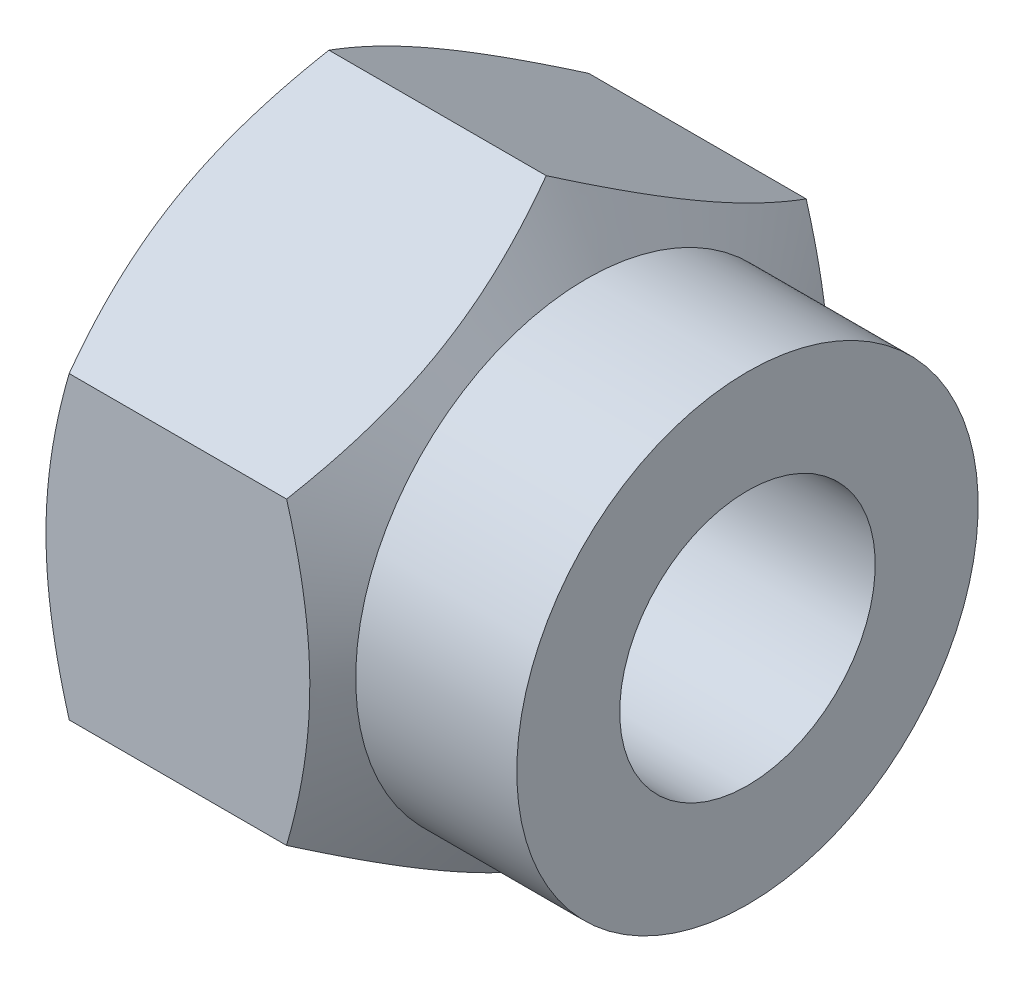
ISO-10303-21;
HEADER;
FILE_DESCRIPTION(('STEP AP214'),'2;1');
FILE_NAME('part.step','',(''),(''),'','','');
FILE_SCHEMA(('AUTOMOTIVE_DESIGN { 1 0 10303 214 1 1 1 1 }'));
ENDSEC;
DATA;
#1=APPLICATION_CONTEXT('core data for automotive mechanical design processes');
#2=APPLICATION_PROTOCOL_DEFINITION('international standard','automotive_design',2000,#1);
#3=PRODUCT_CONTEXT('',#1,'mechanical');
#4=PRODUCT('Part','Part','',(#3));
#5=PRODUCT_RELATED_PRODUCT_CATEGORY('part','',(#4));
#6=PRODUCT_DEFINITION_FORMATION('','',#4);
#7=PRODUCT_DEFINITION_CONTEXT('part definition',#1,'design');
#8=PRODUCT_DEFINITION('design','',#6,#7);
#9=PRODUCT_DEFINITION_SHAPE('','',#8);
#10=(LENGTH_UNIT() NAMED_UNIT(*) SI_UNIT(.MILLI.,.METRE.));
#11=(NAMED_UNIT(*) PLANE_ANGLE_UNIT() SI_UNIT($,.RADIAN.));
#12=(NAMED_UNIT(*) SI_UNIT($,.STERADIAN.) SOLID_ANGLE_UNIT());
#13=UNCERTAINTY_MEASURE_WITH_UNIT(LENGTH_MEASURE(1.E-05),#10,'distance_accuracy_value','');
#14=(GEOMETRIC_REPRESENTATION_CONTEXT(3) GLOBAL_UNCERTAINTY_ASSIGNED_CONTEXT((#13)) GLOBAL_UNIT_ASSIGNED_CONTEXT((#10,
#11,#12)) REPRESENTATION_CONTEXT('',''));
#15=CARTESIAN_POINT('',(0.,0.,0.));
#16=DIRECTION('',(0.,0.,1.));
#17=DIRECTION('',(1.,0.,0.));
#18=AXIS2_PLACEMENT_3D('',#15,#16,#17);
#19=CARTESIAN_POINT('',(-7.86770648630863E-13,5.77499999999995,0.00259341371129267));
#20=DIRECTION('',(0.,0.86602540378445,-0.49999999999998));
#21=DIRECTION('',(0.,0.49999999999998,0.86602540378445));
#22=AXIS2_PLACEMENT_3D('',#19,#20,#21);
#23=PLANE('',#22);
#24=CARTESIAN_POINT('',(0.447446866115409,5.77499964515535,0.0025932774604168));
#25=CARTESIAN_POINT('',(0.379476109185398,5.65739164957564,-0.201110057525818));
#26=CARTESIAN_POINT('',(0.317198562123472,5.53884079225652,-0.406446289102597));
#27=CARTESIAN_POINT('',(0.207368111212527,5.3006927162739,-0.818930943554232));
#28=CARTESIAN_POINT('',(0.159742291939182,5.18110382804692,-1.02606493849483));
#29=CARTESIAN_POINT('',(0.101263150025257,5.00058980202028,-1.33872439110243));
#30=CARTESIAN_POINT('',(0.0839229114067567,4.94018996501232,-1.44333998048222));
#31=CARTESIAN_POINT('',(0.0539060309740201,4.81910059056732,-1.65307293142466));
#32=CARTESIAN_POINT('',(0.0412292656630741,4.75841106084494,-1.75819027962519));
#33=CARTESIAN_POINT('',(0.0207624921934346,4.6365174825838,-1.9693161496736));
#34=CARTESIAN_POINT('',(0.0129973722235834,4.57531238126786,-2.07532649498965));
#35=CARTESIAN_POINT('',(0.00260535476316538,4.45278152955334,-2.28755615596286));
#36=CARTESIAN_POINT('',(-2.05208356367485E-05,4.39145575758665,-2.39377550897709));
#37=CARTESIAN_POINT('',(3.47900495748323E-11,4.33012701892297,-2.49999999999767));
#38=B_SPLINE_CURVE_WITH_KNOTS('',3,(#24,#25,#26,#27,#28,#29,#30,#31,#32,#33,#34,#35,#36,#37),
.UNSPECIFIED.,.F.,.F.,(4,2,2,2,2,2,4),(0.,0.734818386072243,1.4659184211973,1.83194961192585,
2.19797110882767,2.56583274978381,2.93376752923617),.UNSPECIFIED.);
#39=CARTESIAN_POINT('',(0.447446590098363,5.77499964519972,0.00259380752496701));
#40=VERTEX_POINT('',#39);
#41=CARTESIAN_POINT('',(1.73953868917269E-11,4.33012701889626,-2.49999999998368));
#42=VERTEX_POINT('',#41);
#43=EDGE_CURVE('E246',#40,#42,#38,.T.);
#44=ORIENTED_EDGE('',*,*,#43,.F.);
#45=DIRECTION('',(1.,0.,0.));
#46=VECTOR('',#45,1.);
#47=CARTESIAN_POINT('',(-6.96531721189331E-13,5.77499941722784,0.00259442101177652));
#48=LINE('',#47,#46);
#49=CARTESIAN_POINT('',(4.6292372928015,5.77499958682207,0.00259412787428472));
#50=VERTEX_POINT('',#49);
#51=EDGE_CURVE('E242',#50,#40,#48,.F.);
#52=ORIENTED_EDGE('',*,*,#51,.F.);
#53=CARTESIAN_POINT('',(4.6301018522595,2.88675132928964,-5.0000000288525));
#54=CARTESIAN_POINT('',(4.70335874674609,3.01361369098422,-4.7802679728293));
#55=CARTESIAN_POINT('',(4.76998840582848,3.14156112063708,-4.55865652397268));
#56=CARTESIAN_POINT('',(4.88628900768838,3.39967140626251,-4.11159639531331));
#57=CARTESIAN_POINT('',(4.93591880534108,3.52983884787868,-3.88613977294282));
#58=CARTESIAN_POINT('',(5.01315816267062,3.78857939051774,-3.43798800711402));
#59=CARTESIAN_POINT('',(5.0412824191911,3.91711219165528,-3.21536266510464));
#60=CARTESIAN_POINT('',(5.06649871854697,4.11036331352771,-2.88064190340188));
#61=CARTESIAN_POINT('',(5.07207720160437,4.1748243958838,-2.76899203365024));
#62=CARTESIAN_POINT('',(5.07748272794144,4.30380607226849,-2.54558921690654));
#63=CARTESIAN_POINT('',(5.07730994797589,4.36832666440722,-2.43383627318783));
#64=CARTESIAN_POINT('',(5.06891609463271,4.54520691168325,-2.12747069805039));
#65=CARTESIAN_POINT('',(5.0548130086538,4.65750778538959,-1.93295987905661));
#66=CARTESIAN_POINT('',(5.01009329399109,4.8813629396889,-1.54523137827403));
#67=CARTESIAN_POINT('',(4.97946133486853,4.992916429688,-1.35201506583395));
#68=CARTESIAN_POINT('',(4.90289228624982,5.21722256114044,-0.96350544970908));
#69=CARTESIAN_POINT('',(4.85663039669875,5.32994681266453,-0.768261318824162));
#70=CARTESIAN_POINT('',(4.7516401624323,5.55371179734529,-0.380688996402192));
#71=CARTESIAN_POINT('',(4.69293654542829,5.66475540850885,-0.188355820010982));
#72=CARTESIAN_POINT('',(4.62923713650707,5.77499985796322,0.00259316769646688));
#73=B_SPLINE_CURVE_WITH_KNOTS('',3,(#53,#54,#55,#56,#57,#58,#59,#60,#61,#62,#63,#64,#65,#66,#67,
#68,#69,#70,#71,#72),.UNSPECIFIED.,.F.,.F.,(4,2,2,2,2,2,2,2,2,4),(0.,0.792543058340322,
1.58699099131343,2.3617723864132,2.7487889916648,3.13579370266388,3.81021941586707,
4.4852717331079,5.17531615714681,5.86400177975548),.UNSPECIFIED.);
#74=CARTESIAN_POINT('',(4.63010185706844,2.88675133761898,-5.00000001442568));
#75=VERTEX_POINT('',#74);
#76=EDGE_CURVE('E79',#75,#50,#73,.T.);
#77=ORIENTED_EDGE('',*,*,#76,.F.);
#78=DIRECTION('',(-1.,0.,0.));
#79=VECTOR('',#78,1.);
#80=CARTESIAN_POINT('',(-8.3189011235163E-13,2.88675134594831,-4.99999999999886));
#81=LINE('',#80,#79);
#82=CARTESIAN_POINT('',(0.44658197488679,2.88675130261974,-4.99999999999886));
#83=VERTEX_POINT('',#82);
#84=EDGE_CURVE('E70',#83,#75,#81,.F.);
#85=ORIENTED_EDGE('',*,*,#84,.F.);
#86=CARTESIAN_POINT('',(3.90527795465832E-11,4.33012701891596,-2.49999999999505));
#87=CARTESIAN_POINT('',(-2.04347781239395E-05,4.26886381822964,-2.60611097622752));
#88=CARTESIAN_POINT('',(0.00259979055357975,4.20760356879711,-2.71221684073289));
#89=CARTESIAN_POINT('',(0.0129696795387024,4.08520335530182,-2.92422022936687));
#90=CARTESIAN_POINT('',(0.0207183277252618,4.02406336982915,-3.03011779057852));
#91=CARTESIAN_POINT('',(0.0411421559490546,3.90229860004601,-3.24102055841408));
#92=CARTESIAN_POINT('',(0.0537925347229005,3.84167276774815,-3.34602758020541));
#93=CARTESIAN_POINT('',(0.0837477096298515,3.72070994559476,-3.55554133400222));
#94=CARTESIAN_POINT('',(0.101052628273991,3.66037296338454,-3.66004805276564));
#95=CARTESIAN_POINT('',(0.159414599522782,3.48004539369474,-3.9723845654737));
#96=CARTESIAN_POINT('',(0.20694720637829,3.36057866456995,-4.17930701013195));
#97=CARTESIAN_POINT('',(0.316569555325965,3.12267256774014,-4.59137245727168));
#98=CARTESIAN_POINT('',(0.378731998266634,3.00424149841452,-4.79650108653841));
#99=CARTESIAN_POINT('',(0.446581995121033,2.88675133256584,-5.00000002317796));
#100=B_SPLINE_CURVE_WITH_KNOTS('',3,(#86,#87,#88,#89,#90,#91,#92,#93,#94,#95,#96,#97,#98,#99),
.UNSPECIFIED.,.F.,.F.,(4,2,2,2,2,2,4),(0.,0.367541692013302,0.735010629730923,1.10064406687341,
1.46628712870836,2.19661490963425,2.93065157501065),.UNSPECIFIED.);
#101=EDGE_CURVE('E74',#42,#83,#100,.T.);
#102=ORIENTED_EDGE('',*,*,#101,.F.);
#103=EDGE_LOOP('',(#44,#52,#77,#85,#102));
#104=FACE_BOUND('',#103,.T.);
#105=ADVANCED_FACE('F14',(#104),#23,.T.);
#106=CARTESIAN_POINT('',(-6.96531721189331E-13,2.88375828219211,5.00000000000175));
#107=DIRECTION('',(0.,0.865575978606692,0.500777620565324));
#108=DIRECTION('',(0.,-0.500777620565324,0.865575978606692));
#109=AXIS2_PLACEMENT_3D('',#106,#107,#108);
#110=PLANE('',#109);
#111=ORIENTED_EDGE('',*,*,#51,.T.);
#112=CARTESIAN_POINT('',(3.9127696308703E-11,4.32787989302735,2.50388810282462));
#113=CARTESIAN_POINT('',(-2.05207356330569E-05,4.38930400920239,2.39771874285299));
#114=CARTESIAN_POINT('',(0.00260535452877322,4.45072515428429,2.29155451830268));
#115=CARTESIAN_POINT('',(0.0129973707873975,4.57344656470795,2.07943500544961));
#116=CARTESIAN_POINT('',(0.0207624899040598,4.63474685165108,1.97347967980969));
#117=CARTESIAN_POINT('',(0.0412292615364915,4.75682999773085,1.76246338375302));
#118=CARTESIAN_POINT('',(0.0539060258992991,4.81761391128256,1.65740059081804));
#119=CARTESIAN_POINT('',(0.0839229029221797,4.93889160453259,1.44777649080445));
#120=CARTESIAN_POINT('',(0.101263139071082,4.99938537650478,1.34321519708017));
#121=CARTESIAN_POINT('',(0.159742279029541,5.18018013049664,1.03071801332654));
#122=CARTESIAN_POINT('',(0.20736810444815,5.29995498506733,0.823691515536064));
#123=CARTESIAN_POINT('',(0.317198518014824,5.53847346656601,0.411420959583721));
#124=CARTESIAN_POINT('',(0.37947602124551,5.65720875049415,0.206191321994874));
#125=CARTESIAN_POINT('',(0.447446676775376,5.77499979534676,0.00259376744691898));
#126=B_SPLINE_CURVE_WITH_KNOTS('',3,(#112,#113,#114,#115,#116,#117,#118,#119,#120,#121,#122,
#123,#124,#125),.UNSPECIFIED.,.F.,.F.,(4,2,2,2,2,2,4),(0.,0.367934759550382,0.735796381617777,
1.10181786230807,1.46784903620918,2.19894903098639,2.93376737188342),.UNSPECIFIED.);
#127=CARTESIAN_POINT('',(1.74334712358969E-11,4.3278798930076,2.50388810281319));
#128=VERTEX_POINT('',#127);
#129=EDGE_CURVE('E39',#128,#40,#126,.T.);
#130=ORIENTED_EDGE('',*,*,#129,.F.);
#131=CARTESIAN_POINT('',(0.445718332673763,2.88375823625721,5.00000000447355));
#132=CARTESIAN_POINT('',(0.377988875043343,3.00131303138452,4.79681084777198));
#133=CARTESIAN_POINT('',(0.315941372651322,3.11980831009323,4.59199606984289));
#134=CARTESIAN_POINT('',(0.206526861147364,3.35784210957573,4.18056328284652));
#135=CARTESIAN_POINT('',(0.15908736502565,3.47737235074579,3.9739595849001));
#136=CARTESIAN_POINT('',(0.100842414659332,3.65779370820644,3.66210780165439));
#137=CARTESIAN_POINT('',(0.0835727664009411,3.7181616018664,3.55776408448976));
#138=CARTESIAN_POINT('',(0.0536792092067033,3.83918585534981,3.34857804626906));
#139=CARTESIAN_POINT('',(0.0410551787298853,3.89984220758441,3.24373573833007));
#140=CARTESIAN_POINT('',(0.0206742318655982,4.02166740224362,3.03316530186489));
#141=CARTESIAN_POINT('',(0.01294203007458,4.08283728950572,2.92743536737567));
#142=CARTESIAN_POINT('',(0.00259423502614607,4.20529708778435,2.71576804168507));
#143=CARTESIAN_POINT('',(-2.03491375586419E-05,4.266587020087,2.60983061369139));
#144=CARTESIAN_POINT('',(3.48660603012237E-11,4.32787989303312,2.50388810282938));
#145=B_SPLINE_CURVE_WITH_KNOTS('',3,(#131,#132,#133,#134,#135,#136,#137,#138,#139,#140,#141,
#142,#143,#144),.UNSPECIFIED.,.F.,.F.,(4,2,2,2,2,2,4),(0.,0.733255329980803,1.46281122217768,
1.82806634055798,2.19331190227208,2.56038833096965,2.92753713264273),.UNSPECIFIED.);
#146=CARTESIAN_POINT('',(0.445718305181123,2.88375827382559,5.00000001446294));
#147=VERTEX_POINT('',#146);
#148=EDGE_CURVE('E252',#147,#128,#145,.T.);
#149=ORIENTED_EDGE('',*,*,#148,.F.);
#150=DIRECTION('',(1.,0.,0.));
#151=VECTOR('',#150,1.);
#152=CARTESIAN_POINT('',(-8.99569307932779E-13,2.88375828219207,5.00000000000175));
#153=LINE('',#152,#151);
#154=CARTESIAN_POINT('',(4.63096554411235,2.8837582989002,5.00000000000175));
#155=VERTEX_POINT('',#154);
#156=EDGE_CURVE('E244',#155,#147,#153,.F.);
#157=ORIENTED_EDGE('',*,*,#156,.F.);
#158=CARTESIAN_POINT('',(4.62923719496226,5.77499975641631,0.00259383473679707));
#159=CARTESIAN_POINT('',(4.70256423860597,5.64791623130173,0.222253104836878));
#160=CARTESIAN_POINT('',(4.76926860793133,5.51974582250042,0.443791014021758));
#161=CARTESIAN_POINT('',(4.88572467559669,5.26118386320536,0.890705995355452));
#162=CARTESIAN_POINT('',(4.93543515633789,5.13078770657835,1.11609102903878));
#163=CARTESIAN_POINT('',(5.01283560838991,4.87159011924126,1.5641046704202));
#164=CARTESIAN_POINT('',(5.04104025193833,4.74282912353933,1.78666338767129));
#165=CARTESIAN_POINT('',(5.06637274710422,4.54923249243957,2.12128815231226));
#166=CARTESIAN_POINT('',(5.07198921576753,4.48465580114139,2.23290662420503));
#167=CARTESIAN_POINT('',(5.07746825296109,4.35544199118142,2.45624801449988));
#168=CARTESIAN_POINT('',(5.07733100008519,4.29080487445748,2.56797092955244));
#169=CARTESIAN_POINT('',(5.0690388086563,4.11379086205379,2.87393323841211));
#170=CARTESIAN_POINT('',(5.0550275724064,4.00147182167208,3.06807263143213));
#171=CARTESIAN_POINT('',(5.01053045719276,3.77757693961745,3.45506682542324));
#172=CARTESIAN_POINT('',(4.98002934604547,3.66600188180277,3.64792027152377));
#173=CARTESIAN_POINT('',(4.90375296583415,3.44165307825579,4.03569905237302));
#174=CARTESIAN_POINT('',(4.85765407934037,3.32890759260808,4.23057554058916));
#175=CARTESIAN_POINT('',(4.75300650478804,3.10509658873344,4.6174247541843));
#176=CARTESIAN_POINT('',(4.69448239367035,2.9940282110663,4.80940242200213));
#177=CARTESIAN_POINT('',(4.6309655739373,2.88375832560403,4.99999992496583));
#178=B_SPLINE_CURVE_WITH_KNOTS('',3,(#158,#159,#160,#161,#162,#163,#164,#165,#166,#167,#168,
#169,#170,#171,#172,#173,#174,#175,#176,#177),.UNSPECIFIED.,.F.,.F.,(4,2,2,2,2,2,2,2,2,4),(0.,
0.792739044028319,1.5873874068001,2.36236353399635,2.74947693009163,3.13657831030861,
3.81005396710122,4.4841527988123,5.17319547758199,5.86088772891715),.UNSPECIFIED.);
#179=EDGE_CURVE('E181',#50,#155,#178,.T.);
#180=ORIENTED_EDGE('',*,*,#179,.F.);
#181=EDGE_LOOP('',(#111,#130,#149,#157,#180));
#182=FACE_BOUND('',#181,.T.);
#183=ADVANCED_FACE('F158',(#182),#110,.T.);
#184=CARTESIAN_POINT('',(-8.99569307932779E-13,-2.88974596215502,5.00000000000175));
#185=DIRECTION('',(0.,0.,1.));
#186=DIRECTION('',(1.,0.,0.));
#187=AXIS2_PLACEMENT_3D('',#184,#185,#186);
#188=PLANE('',#187);
#189=CARTESIAN_POINT('',(0.4474468091304,-2.8897455540378,4.99999979812474));
#190=CARTESIAN_POINT('',(0.379476071845274,-2.65452929909331,4.99999992948539));
#191=CARTESIAN_POINT('',(0.317198535272355,-2.41742748582765,4.99999998157085));
#192=CARTESIAN_POINT('',(0.20736809679187,-1.94113127687161,5.00000001833939));
#193=CARTESIAN_POINT('',(0.159742279520073,-1.70195354134156,5.0000000033622));
#194=CARTESIAN_POINT('',(0.101263141631739,-1.34092551448991,4.99999999831932));
#195=CARTESIAN_POINT('',(0.0839229045199162,-1.22012584275395,4.99999999954872));
#196=CARTESIAN_POINT('',(0.0539060265783743,-0.977947101689154,5.00000000045477));
#197=CARTESIAN_POINT('',(0.0412292622532055,-0.856568047789433,5.00000000013147));
#198=CARTESIAN_POINT('',(0.0207624904338901,-0.612780901790084,4.99999999987138));
#199=CARTESIAN_POINT('',(0.0129973711202292,-0.490370704132852,4.99999999993656));
#200=CARTESIAN_POINT('',(0.00260535454983307,-0.245309010736739,5.00000000006695));
#201=CARTESIAN_POINT('',(-2.0520817557794E-05,-0.122657471861734,5.00000000013217));
#202=CARTESIAN_POINT('',(3.47886988276211E-11,-1.13717584561064E-12,5.00000000000175));
#203=B_SPLINE_CURVE_WITH_KNOTS('',3,(#189,#190,#191,#192,#193,#194,#195,#196,#197,#198,#199,
#200,#201,#202),.UNSPECIFIED.,.F.,.F.,(4,2,2,2,2,2,4),(0.,0.734818354215512,1.46591835853723,
1.83194953432226,2.1979710163788,2.56583264192473,2.93376740579666),.UNSPECIFIED.);
#204=CARTESIAN_POINT('',(0.447446572878194,-2.88974606710747,4.99999949530542));
#205=VERTEX_POINT('',#204);
#206=CARTESIAN_POINT('',(1.73946204643536E-11,0.,4.99999999997162));
#207=VERTEX_POINT('',#206);
#208=EDGE_CURVE('E137',#205,#207,#203,.T.);
#209=ORIENTED_EDGE('',*,*,#208,.F.);
#210=DIRECTION('',(1.,0.,0.));
#211=VECTOR('',#210,1.);
#212=CARTESIAN_POINT('',(-8.54449844212013E-13,-2.88974654492801,4.9999989906091));
#213=LINE('',#212,#211);
#214=CARTESIAN_POINT('',(4.62923729276793,-2.88974637527534,4.99999928445615));
#215=VERTEX_POINT('',#214);
#216=EDGE_CURVE('E232',#215,#205,#213,.F.);
#217=ORIENTED_EDGE('',*,*,#216,.F.);
#218=CARTESIAN_POINT('',(4.63096553929288,2.88375831560832,5.00000000000175));
#219=CARTESIAN_POINT('',(4.69925910766518,2.6470241018781,5.00000000000175));
#220=CARTESIAN_POINT('',(4.76177925083065,2.40841895485643,5.00000000000175));
#221=CARTESIAN_POINT('',(4.87226997636505,1.92733870038335,5.00000000000175));
#222=CARTESIAN_POINT('',(4.92020810180932,1.68485620625275,5.00000000000175));
#223=CARTESIAN_POINT('',(4.99729643940816,1.20261115917878,5.00000000000175));
#224=CARTESIAN_POINT('',(5.02685729789554,0.962916310742167,5.00000000000175));
#225=CARTESIAN_POINT('',(5.06654053077248,0.48214653113054,5.00000000000175));
#226=CARTESIAN_POINT('',(5.07668394782078,0.241073378216049,5.00000000000175));
#227=CARTESIAN_POINT('',(5.07668375049015,-0.241579820990656,5.00000000000175));
#228=CARTESIAN_POINT('',(5.06649747270137,-0.483159868230482,5.00000000000175));
#229=CARTESIAN_POINT('',(5.0266497361782,-0.964934988187994,5.00000000000175));
#230=CARTESIAN_POINT('',(4.99696703418112,-1.20512826156741,5.00000000000175));
#231=CARTESIAN_POINT('',(4.91956924334094,-1.68837875004515,5.00000000000175));
#232=CARTESIAN_POINT('',(4.87144114420151,-1.93136773480867,5.00000000000175));
#233=CARTESIAN_POINT('',(4.76052755522582,-2.41344086612465,5.00000000000175));
#234=CARTESIAN_POINT('',(4.69777481125953,-2.65253247802993,5.00000000000175));
#235=CARTESIAN_POINT('',(4.62923713625957,-2.88974567893795,5.00000000000175));
#236=B_SPLINE_CURVE_WITH_KNOTS('',3,(#218,#219,#220,#221,#222,#223,#224,#225,#226,#227,#228,
#229,#230,#231,#232,#233,#234,#235),.UNSPECIFIED.,.F.,.F.,(4,2,2,2,2,2,2,2,4),(0.,
0.739390764572769,1.48041543514865,2.20422287654854,2.92724548362699,3.65178700406731,
4.37711929596218,5.11974299580845,5.86071960572372),.UNSPECIFIED.);
#237=EDGE_CURVE('E172',#155,#215,#236,.T.);
#238=ORIENTED_EDGE('',*,*,#237,.F.);
#239=ORIENTED_EDGE('',*,*,#156,.T.);
#240=CARTESIAN_POINT('',(3.90357296922762E-11,0.,4.9999999999944));
#241=CARTESIAN_POINT('',(-2.03491179558507E-05,0.122395386348885,4.99999999999911));
#242=CARTESIAN_POINT('',(0.00259423481197501,0.24478490048744,5.00000000000104));
#243=CARTESIAN_POINT('',(0.0129420289647213,0.489324169079602,5.00000000000246));
#244=CARTESIAN_POINT('',(0.0206742300962482,0.611473966039261,5.00000000000194));
#245=CARTESIAN_POINT('',(0.0410551753012019,0.854745998688679,5.00000000000156));
#246=CARTESIAN_POINT('',(0.0536792047865578,0.975870320807122,5.0000000000017));
#247=CARTESIAN_POINT('',(0.0835727594751373,1.21754295848107,5.0000000000018));
#248=CARTESIAN_POINT('',(0.100842406218069,1.33809125888257,5.00000000000177));
#249=CARTESIAN_POINT('',(0.159087352534765,1.69837363446624,5.00000000000171));
#250=CARTESIAN_POINT('',(0.206526846642071,1.9370628919918,5.00000000000173));
#251=CARTESIAN_POINT('',(0.315941345639801,2.41239121033737,5.00000000000177));
#252=CARTESIAN_POINT('',(0.377988837479707,2.64901373757024,5.00000000000179));
#253=CARTESIAN_POINT('',(0.445718275348788,2.88375819547641,5.00000000000175));
#254=B_SPLINE_CURVE_WITH_KNOTS('',3,(#240,#241,#242,#243,#244,#245,#246,#247,#248,#249,#250,
#251,#252,#253),.UNSPECIFIED.,.F.,.F.,(4,2,2,2,2,2,4),(0.,0.367148785975335,0.734225199145915,
1.09947074590047,1.46472584922259,2.19428171038215,2.92753700826709),.UNSPECIFIED.);
#255=EDGE_CURVE('E165',#207,#147,#254,.T.);
#256=ORIENTED_EDGE('',*,*,#255,.F.);
#257=EDGE_LOOP('',(#209,#217,#238,#239,#256));
#258=FACE_BOUND('',#257,.T.);
#259=ADVANCED_FACE('F154',(#258),#188,.T.);
#260=CARTESIAN_POINT('',(-8.54449844212013E-13,-5.77499999999981,0.00259341371129267));
#261=DIRECTION('',(0.,-0.866025403784429,0.500000000000016));
#262=DIRECTION('',(0.,-0.500000000000016,-0.866025403784429));
#263=AXIS2_PLACEMENT_3D('',#260,#261,#262);
#264=PLANE('',#263);
#265=CARTESIAN_POINT('',(0.447446866100578,-5.77499964518911,0.00259355008515264));
#266=CARTESIAN_POINT('',(0.374223181992595,-5.64809736287592,0.222395057394044));
#267=CARTESIAN_POINT('',(0.307634577775572,-5.52010953785529,0.444076598636025));
#268=CARTESIAN_POINT('',(0.191430506286877,-5.26191981673797,0.891274405461737));
#269=CARTESIAN_POINT('',(0.141856098408826,-5.13171334960357,1.11679858793262));
#270=CARTESIAN_POINT('',(0.064736555876723,-4.87289343824876,1.56508780089534));
#271=CARTESIAN_POINT('',(0.036677117181881,-4.74432018933825,1.78778320998529));
#272=CARTESIAN_POINT('',(0.0115629245090145,-4.55101053857612,2.12260534988851));
#273=CARTESIAN_POINT('',(0.00601927680490211,-4.48653021271325,2.23428854959882));
#274=CARTESIAN_POINT('',(0.00068420943561767,-4.35751084966668,2.457756640976));
#275=CARTESIAN_POINT('',(0.000892610795105231,-4.2929718143722,2.56954152937058));
#276=CARTESIAN_POINT('',(0.00936826411078875,-4.1163633727545,2.87543632356285));
#277=CARTESIAN_POINT('',(0.0234671314436565,-4.00435312153837,3.06944376951494));
#278=CARTESIAN_POINT('',(0.0680836926893444,-3.7810756322265,3.45617172509883));
#279=CARTESIAN_POINT('',(0.0986164862481142,-3.6698091728707,3.64889088591364));
#280=CARTESIAN_POINT('',(0.174904838189615,-3.44608567517572,4.03639135079478));
#281=CARTESIAN_POINT('',(0.220982110238693,-3.3336567232822,4.23112400770939));
#282=CARTESIAN_POINT('',(0.325545433732863,-3.11047090352772,4.6176931870397));
#283=CARTESIAN_POINT('',(0.384007085491965,-2.99971119993365,4.80953462108924));
#284=CARTESIAN_POINT('',(0.447446710675089,-2.88974610804648,4.9999997473101));
#285=B_SPLINE_CURVE_WITH_KNOTS('',3,(#265,#266,#267,#268,#269,#270,#271,#272,#273,#274,#275,
#276,#277,#278,#279,#280,#281,#282,#283,#284),.UNSPECIFIED.,.F.,.F.,(4,2,2,2,2,2,2,2,2,4),(0.,
0.792746169358114,1.58739219334857,2.36239317721294,2.7495206626483,3.13663610260307,
3.80932728082584,4.48263759176508,5.17083791726198,5.85769475653616),.UNSPECIFIED.);
#286=CARTESIAN_POINT('',(0.447446590129613,-5.77499964560782,0.00259301971257591));
#287=VERTEX_POINT('',#286);
#288=EDGE_CURVE('E330',#287,#205,#285,.T.);
#289=ORIENTED_EDGE('',*,*,#288,.F.);
#290=DIRECTION('',(1.,0.,0.));
#291=VECTOR('',#290,1.);
#292=CARTESIAN_POINT('',(-8.09330380491247E-13,-5.77499941813259,0.00259240588757273));
#293=LINE('',#292,#291);
#294=CARTESIAN_POINT('',(4.62923729269129,-5.77499958765423,0.00259269950767238));
#295=VERTEX_POINT('',#294);
#296=EDGE_CURVE('E234',#295,#287,#293,.F.);
#297=ORIENTED_EDGE('',*,*,#296,.F.);
#298=CARTESIAN_POINT('',(4.62923719489514,-2.88974620562267,4.99999957830319));
#299=CARTESIAN_POINT('',(4.70246077625673,-3.01664862418087,4.78019814175702));
#300=CARTESIAN_POINT('',(4.76904933329569,-3.14463649973321,4.55851663854757));
#301=CARTESIAN_POINT('',(4.8852533608616,-3.4028262470838,4.111318878143));
#302=CARTESIAN_POINT('',(4.9348277720203,-3.53303268974897,3.88579470397413));
#303=CARTESIAN_POINT('',(5.01194731031267,-3.79185257448144,3.43750551360839));
#304=CARTESIAN_POINT('',(5.04000674155126,-3.92042582075178,3.21481011857411));
#305=CARTESIAN_POINT('',(5.06512092817516,-4.11373546207458,2.87998799821011));
#306=CARTESIAN_POINT('',(5.07066457472127,-4.17821578381252,2.76830480487162));
#307=CARTESIAN_POINT('',(5.07599964014351,-4.30723513900292,2.54483672652208));
#308=CARTESIAN_POINT('',(5.0757912379981,-4.3717741705661,2.43305184478336));
#309=CARTESIAN_POINT('',(5.06731558328339,-4.54838260757254,2.12715705884289));
#310=CARTESIAN_POINT('',(5.05321671520348,-4.66039285780271,1.93314961447574));
#311=CARTESIAN_POINT('',(5.00860015272244,-4.88367034538516,1.54642166179663));
#312=CARTESIAN_POINT('',(4.97806735864877,-4.99493680399617,1.3537025023041));
#313=CARTESIAN_POINT('',(4.90177900624407,-5.21866029934354,0.966202041515577));
#314=CARTESIAN_POINT('',(4.8557017343633,-5.33108924964356,0.771469387354327));
#315=CARTESIAN_POINT('',(4.7511384117364,-5.55427506599441,0.384900213905929));
#316=CARTESIAN_POINT('',(4.69267676070417,-5.66503476778162,0.193058782979303));
#317=CARTESIAN_POINT('',(4.62923713641574,-5.77499985790023,0.00259365983500013));
#318=B_SPLINE_CURVE_WITH_KNOTS('',3,(#298,#299,#300,#301,#302,#303,#304,#305,#306,#307,#308,
#309,#310,#311,#312,#313,#314,#315,#316,#317),.UNSPECIFIED.,.F.,.F.,(4,2,2,2,2,2,2,2,2,4),(0.,
0.792746111833306,1.58739208255183,2.36239302261458,2.74952048535082,3.13663590239695,
3.80932707522819,4.48263738187294,5.17083769794242,5.8576945262253),.UNSPECIFIED.);
#319=EDGE_CURVE('E180',#215,#295,#318,.T.);
#320=ORIENTED_EDGE('',*,*,#319,.F.);
#321=ORIENTED_EDGE('',*,*,#216,.T.);
#322=EDGE_LOOP('',(#289,#297,#320,#321));
#323=FACE_BOUND('',#322,.T.);
#324=ADVANCED_FACE('F157',(#323),#264,.T.);
#325=CARTESIAN_POINT('',(-8.09330380491247E-13,-2.88675134594817,-4.99999999999886));
#326=DIRECTION('',(0.,-0.866025403784446,-0.499999999999987));
#327=DIRECTION('',(0.,0.499999999999987,-0.866025403784446));
#328=AXIS2_PLACEMENT_3D('',#325,#326,#327);
#329=PLANE('',#328);
#330=CARTESIAN_POINT('',(0.446581962382129,-2.88675138927246,-4.99999992494809));
#331=CARTESIAN_POINT('',(0.378731970095126,-3.00424155065497,-4.7965009960512));
#332=CARTESIAN_POINT('',(0.316569531510834,-3.12267261544196,-4.59137237464846));
#333=CARTESIAN_POINT('',(0.206947190441444,-3.36057870310492,-4.17930694338825));
#334=CARTESIAN_POINT('',(0.159414587115951,-3.48004542760269,-3.97238450674346));
#335=CARTESIAN_POINT('',(0.101052620303748,-3.66037299022969,-3.66004800626817));
#336=CARTESIAN_POINT('',(0.0837477029968308,-3.72070997005893,-3.55554129162871));
#337=CARTESIAN_POINT('',(0.0537925304259783,-3.84167278741866,-3.34602754613504));
#338=CARTESIAN_POINT('',(0.0411421526510459,-3.90229861730383,-3.24102052852287));
#339=CARTESIAN_POINT('',(0.0207183260533313,-4.02406338220752,-3.03011776913798));
#340=CARTESIAN_POINT('',(0.01296967849065,-4.08520336521325,-2.92422021219815));
#341=CARTESIAN_POINT('',(0.00259979034241251,-4.2076035737614,-2.71221683213574));
#342=CARTESIAN_POINT('',(-2.04347765274412E-05,-4.26886382071371,-2.60611097193012));
#343=CARTESIAN_POINT('',(3.46507983916425E-11,-4.33012701892164,-2.49999999999981));
#344=B_SPLINE_CURVE_WITH_KNOTS('',3,(#330,#331,#332,#333,#334,#335,#336,#337,#338,#339,#340,
#341,#342,#343),.UNSPECIFIED.,.F.,.F.,(4,2,2,2,2,2,4),(0.,0.734036635766671,1.4643643874411,
1.83000743457425,2.19564085701755,2.56310977986023,2.93065145698404),.UNSPECIFIED.);
#345=CARTESIAN_POINT('',(0.446581974886692,-2.8867513676124,-4.99999996247525));
#346=VERTEX_POINT('',#345);
#347=CARTESIAN_POINT('',(1.73260751748704E-11,-4.33012701889626,-2.49999999998375));
#348=VERTEX_POINT('',#347);
#349=EDGE_CURVE('E96',#346,#348,#344,.T.);
#350=ORIENTED_EDGE('',*,*,#349,.F.);
#351=DIRECTION('',(-1.,0.,0.));
#352=VECTOR('',#351,1.);
#353=CARTESIAN_POINT('',(-8.3189011235163E-13,-2.88675134594808,-4.99999999999886));
#354=LINE('',#353,#352);
#355=CARTESIAN_POINT('',(4.63010185706761,-2.88675136260962,-4.99999999999886));
#356=VERTEX_POINT('',#355);
#357=EDGE_CURVE('E82',#356,#346,#354,.T.);
#358=ORIENTED_EDGE('',*,*,#357,.F.);
#359=CARTESIAN_POINT('',(4.62923719474183,-5.77499975717587,0.00259299312776806));
#360=CARTESIAN_POINT('',(4.70256452068445,-5.64811308700428,-0.217181166412662));
#361=CARTESIAN_POINT('',(4.76926911906765,-5.52014120987902,-0.438834959533589));
#362=CARTESIAN_POINT('',(4.88572552792005,-5.26197968567415,-0.88598383601587));
#363=CARTESIAN_POINT('',(4.93543611216325,-5.13178543865697,-1.11148688670279));
#364=CARTESIAN_POINT('',(5.0128362469975,-4.87299026054366,-1.5597332839489));
#365=CARTESIAN_POINT('',(5.04104064085838,-4.74442971485902,-1.78240668092348));
#366=CARTESIAN_POINT('',(5.06637287929629,-4.55113449775993,-2.11720381779918));
#367=CARTESIAN_POINT('',(5.07198928267283,-4.48665836696073,-2.22887975221886));
#368=CARTESIAN_POINT('',(5.07746825668084,-4.35764576956003,-2.45233612573331));
#369=CARTESIAN_POINT('',(5.07733100491261,-4.29310930488237,-2.56411656149588));
#370=CARTESIAN_POINT('',(5.06903285046428,-4.11624408195098,-2.87045611370506));
#371=CARTESIAN_POINT('',(5.05499586284044,-4.00397325365647,-3.06491489251901));
#372=CARTESIAN_POINT('',(5.01041169022396,-3.78017576567616,-3.45254351230719));
#373=CARTESIAN_POINT('',(4.97984918869463,-3.66864989367856,-3.64571198896546));
#374=CARTESIAN_POINT('',(4.90341969706842,-3.4443984409048,-4.03412689884077));
#375=CARTESIAN_POINT('',(4.85722797878566,-3.33170119933448,-4.22932424711342));
#376=CARTESIAN_POINT('',(4.75237453073447,-3.10798869210284,-4.61680567592726));
#377=CARTESIAN_POINT('',(4.69373750092368,-2.99697055474282,-4.80909473039648));
#378=CARTESIAN_POINT('',(4.6301018868786,-2.88675138925159,-4.99999992499515));
#379=B_SPLINE_CURVE_WITH_KNOTS('',3,(#359,#360,#361,#362,#363,#364,#365,#366,#367,#368,#369,
#370,#371,#372,#373,#374,#375,#376,#377,#378),.UNSPECIFIED.,.F.,.F.,(4,2,2,2,2,2,2,2,2,4),(0.,
0.792742076863147,1.58739386270764,2.36236690426537,2.74947858145891,3.1365783095367,
3.81081207507674,4.48567182248932,5.17551495446448,5.8640015616647),.UNSPECIFIED.);
#380=EDGE_CURVE('E211',#295,#356,#379,.T.);
#381=ORIENTED_EDGE('',*,*,#380,.F.);
#382=ORIENTED_EDGE('',*,*,#296,.T.);
#383=CARTESIAN_POINT('',(3.888149445435E-11,-4.3301270189159,-2.49999999999509));
#384=CARTESIAN_POINT('',(-2.05207358775123E-05,-4.39145575413159,-2.39377551464698));
#385=CARTESIAN_POINT('',(0.00260535452958145,-4.45278152286773,-2.28755616738661));
#386=CARTESIAN_POINT('',(0.0129973707923082,-4.57531236830504,-2.07532651759764));
#387=CARTESIAN_POINT('',(0.0207624899120192,-4.63651746657401,-1.96931617771249));
#388=CARTESIAN_POINT('',(0.041229261552407,-4.75841103878064,-1.75819031753379));
#389=CARTESIAN_POINT('',(0.0539060259201058,-4.81910056549601,-1.65307297377572));
#390=CARTESIAN_POINT('',(0.0839229029544234,-4.94018993560066,-1.44334003249815));
#391=CARTESIAN_POINT('',(0.101263139109871,-5.00058977127579,-1.33872444833994));
#392=CARTESIAN_POINT('',(0.159742279090049,-5.18110378248735,-1.02606500944334));
#393=CARTESIAN_POINT('',(0.207368104525938,-5.30069264755899,-0.818931019119802));
#394=CARTESIAN_POINT('',(0.317198518131181,-5.53884075137633,-0.406446403582041));
#395=CARTESIAN_POINT('',(0.379476021383196,-5.65739166007742,-0.201110206428317));
#396=CARTESIAN_POINT('',(0.447446676935427,-5.77499979594173,0.00259306027221566));
#397=B_SPLINE_CURVE_WITH_KNOTS('',3,(#383,#384,#385,#386,#387,#388,#389,#390,#391,#392,#393,
#394,#395,#396),.UNSPECIFIED.,.F.,.F.,(4,2,2,2,2,2,4),(0.,0.367934759623225,0.735796381763394,
1.1018178625256,1.46784903649863,2.19894903141896,2.93376737246085),.UNSPECIFIED.);
#398=EDGE_CURVE('E145',#348,#287,#397,.T.);
#399=ORIENTED_EDGE('',*,*,#398,.F.);
#400=EDGE_LOOP('',(#350,#358,#381,#382,#399));
#401=FACE_BOUND('',#400,.T.);
#402=ADVANCED_FACE('F118',(#401),#329,.T.);
#403=CARTESIAN_POINT('',(-8.3189011235163E-13,2.88675134594831,-4.99999999999886));
#404=DIRECTION('',(0.,0.,-1.));
#405=DIRECTION('',(-1.,0.,0.));
#406=AXIS2_PLACEMENT_3D('',#403,#404,#405);
#407=PLANE('',#406);
#408=CARTESIAN_POINT('',(0.446581962382211,2.88675125929023,-4.9999999999934));
#409=CARTESIAN_POINT('',(0.378731970095208,2.65177093653134,-4.99999999999695));
#410=CARTESIAN_POINT('',(0.316569531510919,2.4149088069598,-4.99999999999836));
#411=CARTESIAN_POINT('',(0.206947190441538,1.93909663163558,-4.99999999999936));
#412=CARTESIAN_POINT('',(0.159414587116051,1.70016318263933,-4.99999999999895));
#413=CARTESIAN_POINT('',(0.101052620303856,1.33950805738509,-4.99999999999882));
#414=CARTESIAN_POINT('',(0.0837477029969413,1.21883409772665,-4.99999999999885));
#415=CARTESIAN_POINT('',(0.053792530426094,0.976908463007233,-4.99999999999888));
#416=CARTESIAN_POINT('',(0.0411421526511643,0.855656803236866,-4.99999999999887));
#417=CARTESIAN_POINT('',(0.0207183260534554,0.61212727342947,-4.99999999999886));
#418=CARTESIAN_POINT('',(0.012969678490777,0.489847307418009,-4.99999999999886));
#419=CARTESIAN_POINT('',(0.00259979034254492,0.245046890321719,-4.99999999999886));
#420=CARTESIAN_POINT('',(-2.0434776392547E-05,0.122526396417095,-4.99999999999887));
#421=CARTESIAN_POINT('',(3.47876153446926E-11,1.22636300104275E-12,-4.99999999999886));
#422=B_SPLINE_CURVE_WITH_KNOTS('',3,(#408,#409,#410,#411,#412,#413,#414,#415,#416,#417,#418,
#419,#420,#421),.UNSPECIFIED.,.F.,.F.,(4,2,2,2,2,2,4),(0.,0.734036635766675,1.46436438744111,
1.83000743457426,2.19564085701756,2.56310977986024,2.93065145698406),.UNSPECIFIED.);
#423=CARTESIAN_POINT('',(1.7394051617835E-11,0.,-4.99999999996874));
#424=VERTEX_POINT('',#423);
#425=EDGE_CURVE('E18',#83,#424,#422,.T.);
#426=ORIENTED_EDGE('',*,*,#425,.F.);
#427=ORIENTED_EDGE('',*,*,#84,.T.);
#428=CARTESIAN_POINT('',(4.63010185225784,-2.88675137927116,-4.99999999999886));
#429=CARTESIAN_POINT('',(4.69851741843109,-2.6497777154258,-4.99999999999886));
#430=CARTESIAN_POINT('',(4.76115380184215,-2.4109293801054,-4.99999999999886));
#431=CARTESIAN_POINT('',(4.87185583941505,-1.92935278399236,-4.99999999999886));
#432=CARTESIAN_POINT('',(4.91988889245962,-1.68661709727571,-4.99999999999886));
#433=CARTESIAN_POINT('',(4.9971318555149,-1.20386943496578,-4.99999999999886));
#434=CARTESIAN_POINT('',(5.02675359270775,-0.963925426402351,-4.99999999999886));
#435=CARTESIAN_POINT('',(5.06651901821274,-0.482653086044545,-4.99999999999886));
#436=CARTESIAN_POINT('',(5.07668384925702,-0.241326543019965,-4.99999999999886));
#437=CARTESIAN_POINT('',(5.07668384926097,0.241326532872608,-4.99999999999886));
#438=CARTESIAN_POINT('',(5.06651901907549,0.482653065740602,-4.99999999999886));
#439=CARTESIAN_POINT('',(5.02675359686664,0.963925385954513,-4.99999999999886));
#440=CARTESIAN_POINT('',(4.99713186211516,1.20386938453106,-4.99999999999886));
#441=CARTESIAN_POINT('',(4.91988890526035,1.68661702669507,-4.99999999999886));
#442=CARTESIAN_POINT('',(4.87185585602226,1.92935270326322,-4.99999999999886));
#443=CARTESIAN_POINT('',(4.76115382692224,2.41092927948209,-4.99999999999886));
#444=CARTESIAN_POINT('',(4.69851744817178,2.64977760505525,-4.99999999999886));
#445=CARTESIAN_POINT('',(4.63010188688966,2.8867512593032,-4.99999999999886));
#446=B_SPLINE_CURVE_WITH_KNOTS('',3,(#428,#429,#430,#431,#432,#433,#434,#435,#436,#437,#438,
#439,#440,#441,#442,#443,#444,#445),.UNSPECIFIED.,.F.,.F.,(4,2,2,2,2,2,2,2,4),(0.,
0.740183498493216,1.48200748267365,2.20657717391353,2.93035906780956,3.65414093127129,
4.37871059195791,5.12053454409877,5.86071801081658),.UNSPECIFIED.);
#447=EDGE_CURVE('E124',#356,#75,#446,.T.);
#448=ORIENTED_EDGE('',*,*,#447,.F.);
#449=ORIENTED_EDGE('',*,*,#357,.T.);
#450=CARTESIAN_POINT('',(3.90349097983532E-11,0.,-4.99999999999151));
#451=CARTESIAN_POINT('',(-2.04347781355386E-05,-0.122526401380848,-4.99999999999622));
#452=CARTESIAN_POINT('',(0.0025997905535688,-0.245046900249268,-4.99999999999816));
#453=CARTESIAN_POINT('',(0.0129696795386878,-0.489847327242326,-4.99999999999957));
#454=CARTESIAN_POINT('',(0.0207183277252428,-0.61212729818677,-4.99999999999905));
#455=CARTESIAN_POINT('',(0.0411421559490282,-0.855656837752384,-4.99999999999867));
#456=CARTESIAN_POINT('',(0.053792534722871,-0.976908502348347,-4.99999999999881));
#457=CARTESIAN_POINT('',(0.0837477096298156,-1.21883414665531,-4.99999999999891));
#458=CARTESIAN_POINT('',(0.101052628273952,-1.33950811107571,-4.99999999999888));
#459=CARTESIAN_POINT('',(0.159414599522734,-1.70016325045523,-4.99999999999883));
#460=CARTESIAN_POINT('',(0.206947206378236,-1.93909670870485,-4.99999999999884));
#461=CARTESIAN_POINT('',(0.316569555325901,-2.41490890236456,-4.99999999999888));
#462=CARTESIAN_POINT('',(0.378731998266565,-2.65177104101583,-4.9999999999989));
#463=CARTESIAN_POINT('',(0.446581995120959,-2.88675137271315,-4.99999999999886));
#464=B_SPLINE_CURVE_WITH_KNOTS('',3,(#450,#451,#452,#453,#454,#455,#456,#457,#458,#459,#460,
#461,#462,#463),.UNSPECIFIED.,.F.,.F.,(4,2,2,2,2,2,4),(0.,0.367541692013299,0.735010629730918,
1.10064406687341,1.46628712870835,2.19661490963424,2.93065157501063),.UNSPECIFIED.);
#465=EDGE_CURVE('E89',#424,#346,#464,.T.);
#466=ORIENTED_EDGE('',*,*,#465,.F.);
#467=EDGE_LOOP('',(#426,#427,#448,#449,#466));
#468=FACE_BOUND('',#467,.T.);
#469=ADVANCED_FACE('F86',(#468),#407,.T.);
#470=CARTESIAN_POINT('',(0.449261479275265,0.,1.4437236128817E-12));
#471=DIRECTION('',(1.,0.,0.));
#472=DIRECTION('',(0.,1.,0.));
#473=AXIS2_PLACEMENT_3D('',#470,#471,#472);
#474=CONICAL_SURFACE('',#473,5.77814370797258,1.0471975512212);
#475=CARTESIAN_POINT('',(0.,0.,1.4437236128817E-12));
#476=DIRECTION('',(1.,0.,0.));
#477=DIRECTION('',(0.,1.,0.));
#478=AXIS2_PLACEMENT_3D('',#475,#476,#477);
#479=CIRCLE('',#478,4.99999999994005);
#480=EDGE_CURVE('E94',#42,#424,#479,.F.);
#481=ORIENTED_EDGE('',*,*,#480,.F.);
#482=ORIENTED_EDGE('',*,*,#101,.T.);
#483=ORIENTED_EDGE('',*,*,#425,.T.);
#484=EDGE_LOOP('',(#481,#482,#483));
#485=FACE_BOUND('',#484,.T.);
#486=ADVANCED_FACE('F92',(#485),#474,.T.);
#487=CARTESIAN_POINT('',(0.449261479275265,0.,1.4437236128817E-12));
#488=DIRECTION('',(1.,0.,0.));
#489=DIRECTION('',(0.,1.,0.));
#490=AXIS2_PLACEMENT_3D('',#487,#488,#489);
#491=CONICAL_SURFACE('',#490,5.77814370797258,1.0471975512212);
#492=CARTESIAN_POINT('',(0.,0.,1.4437236128817E-12));
#493=DIRECTION('',(1.,0.,0.));
#494=DIRECTION('',(0.,1.,0.));
#495=AXIS2_PLACEMENT_3D('',#492,#493,#494);
#496=CIRCLE('',#495,4.99999999994005);
#497=EDGE_CURVE('E324',#424,#348,#496,.F.);
#498=ORIENTED_EDGE('',*,*,#497,.F.);
#499=ORIENTED_EDGE('',*,*,#465,.T.);
#500=ORIENTED_EDGE('',*,*,#349,.T.);
#501=EDGE_LOOP('',(#498,#499,#500));
#502=FACE_BOUND('',#501,.T.);
#503=ADVANCED_FACE('F112',(#502),#491,.T.);
#504=CARTESIAN_POINT('',(0.450131137370136,0.,1.4437236128817E-12));
#505=DIRECTION('',(1.,0.,0.));
#506=DIRECTION('',(0.,1.,0.));
#507=AXIS2_PLACEMENT_3D('',#504,#505,#506);
#508=CONICAL_SURFACE('',#507,5.77964999996683,1.04719755121489);
#509=ORIENTED_EDGE('',*,*,#398,.T.);
#510=ORIENTED_EDGE('',*,*,#288,.T.);
#511=ORIENTED_EDGE('',*,*,#208,.T.);
#512=CARTESIAN_POINT('',(0.,0.,1.4437236128817E-12));
#513=DIRECTION('',(1.,0.,0.));
#514=DIRECTION('',(0.,1.,0.));
#515=AXIS2_PLACEMENT_3D('',#512,#513,#514);
#516=CIRCLE('',#515,4.99999999994005);
#517=EDGE_CURVE('E321',#348,#207,#516,.F.);
#518=ORIENTED_EDGE('',*,*,#517,.F.);
#519=EDGE_LOOP('',(#509,#510,#511,#518));
#520=FACE_BOUND('',#519,.T.);
#521=ADVANCED_FACE('F151',(#520),#508,.T.);
#522=CARTESIAN_POINT('',(0.448392610167048,0.,1.4437236128817E-12));
#523=DIRECTION('',(1.,0.,0.));
#524=DIRECTION('',(0.,1.,0.));
#525=AXIS2_PLACEMENT_3D('',#522,#523,#524);
#526=CONICAL_SURFACE('',#525,5.77663878249413,1.04719755120012);
#527=ORIENTED_EDGE('',*,*,#148,.T.);
#528=CARTESIAN_POINT('',(0.,0.,1.4437236128817E-12));
#529=DIRECTION('',(1.,0.,0.));
#530=DIRECTION('',(0.,1.,0.));
#531=AXIS2_PLACEMENT_3D('',#528,#529,#530);
#532=CIRCLE('',#531,4.99999999994005);
#533=EDGE_CURVE('E311',#207,#128,#532,.F.);
#534=ORIENTED_EDGE('',*,*,#533,.F.);
#535=ORIENTED_EDGE('',*,*,#255,.T.);
#536=EDGE_LOOP('',(#527,#534,#535));
#537=FACE_BOUND('',#536,.T.);
#538=ADVANCED_FACE('F266',(#537),#526,.T.);
#539=CARTESIAN_POINT('',(0.450131137370136,0.,1.4437236128817E-12));
#540=DIRECTION('',(1.,0.,0.));
#541=DIRECTION('',(0.,1.,0.));
#542=AXIS2_PLACEMENT_3D('',#539,#540,#541);
#543=CONICAL_SURFACE('',#542,5.77964999996683,1.04719755121489);
#544=ORIENTED_EDGE('',*,*,#43,.T.);
#545=CARTESIAN_POINT('',(0.,0.,1.4437236128817E-12));
#546=DIRECTION('',(1.,0.,0.));
#547=DIRECTION('',(0.,1.,0.));
#548=AXIS2_PLACEMENT_3D('',#545,#546,#547);
#549=CIRCLE('',#548,4.99999999994005);
#550=EDGE_CURVE('E250',#128,#42,#549,.F.);
#551=ORIENTED_EDGE('',*,*,#550,.F.);
#552=ORIENTED_EDGE('',*,*,#129,.T.);
#553=EDGE_LOOP('',(#544,#551,#552));
#554=FACE_BOUND('',#553,.T.);
#555=ADVANCED_FACE('F197',(#554),#543,.T.);
#556=CARTESIAN_POINT('',(4.62461281500737,0.,1.4437236128817E-12));
#557=DIRECTION('',(-1.,0.,0.));
#558=DIRECTION('',(0.,-1.,0.));
#559=AXIS2_PLACEMENT_3D('',#556,#557,#558);
#560=CONICAL_SURFACE('',#559,5.78300999996062,1.04719755120007);
#561=CARTESIAN_POINT('',(5.39999999999868,0.,1.44382283906452E-12));
#562=DIRECTION('',(1.,0.,0.));
#563=DIRECTION('',(0.,1.,0.));
#564=AXIS2_PLACEMENT_3D('',#561,#562,#563);
#565=CIRCLE('',#564,4.44000000000015);
#566=CARTESIAN_POINT('',(5.39999999999868,4.44000000000005,1.44382283906452E-12));
#567=VERTEX_POINT('',#566);
#568=EDGE_CURVE('E306',#567,#567,#565,.T.);
#569=ORIENTED_EDGE('',*,*,#568,.F.);
#570=EDGE_LOOP('',(#569));
#571=FACE_BOUND('',#570,.T.);
#572=ORIENTED_EDGE('',*,*,#380,.T.);
#573=ORIENTED_EDGE('',*,*,#447,.T.);
#574=ORIENTED_EDGE('',*,*,#76,.T.);
#575=ORIENTED_EDGE('',*,*,#179,.T.);
#576=ORIENTED_EDGE('',*,*,#237,.T.);
#577=ORIENTED_EDGE('',*,*,#319,.T.);
#578=EDGE_LOOP('',(#572,#573,#574,#575,#576,#577));
#579=FACE_BOUND('',#578,.T.);
#580=ADVANCED_FACE('F191',(#571,#579),#560,.T.);
#581=CARTESIAN_POINT('',(-8.09330380491247E-13,0.,-3.72936706131572));
#582=DIRECTION('',(-1.,0.,0.));
#583=DIRECTION('',(0.,-1.,0.));
#584=AXIS2_PLACEMENT_3D('',#581,#582,#583);
#585=PLANE('',#584);
#586=ORIENTED_EDGE('',*,*,#533,.T.);
#587=ORIENTED_EDGE('',*,*,#550,.T.);
#588=ORIENTED_EDGE('',*,*,#480,.T.);
#589=ORIENTED_EDGE('',*,*,#497,.T.);
#590=ORIENTED_EDGE('',*,*,#517,.T.);
#591=EDGE_LOOP('',(#586,#587,#588,#589,#590));
#592=FACE_BOUND('',#591,.T.);
#593=CARTESIAN_POINT('',(0.,0.,1.44382283906452E-12));
#594=DIRECTION('',(-1.,0.,0.));
#595=DIRECTION('',(0.,-1.,0.));
#596=AXIS2_PLACEMENT_3D('',#593,#594,#595);
#597=CIRCLE('',#596,2.9999999999859);
#598=CARTESIAN_POINT('',(0.,-2.9999999999859,1.44382283906452E-12));
#599=VERTEX_POINT('',#598);
#600=EDGE_CURVE('E307',#599,#599,#597,.F.);
#601=ORIENTED_EDGE('',*,*,#600,.T.);
#602=EDGE_LOOP('',(#601));
#603=FACE_BOUND('',#602,.T.);
#604=ADVANCED_FACE('F196',(#592,#603),#585,.T.);
#605=CARTESIAN_POINT('',(6.94999999999912,0.,1.44382283906452E-12));
#606=DIRECTION('',(1.,0.,0.));
#607=DIRECTION('',(0.,1.,0.));
#608=AXIS2_PLACEMENT_3D('',#605,#606,#607);
#609=CYLINDRICAL_SURFACE('',#608,4.44000000000015);
#610=CARTESIAN_POINT('',(8.49999999999929,0.,1.44382283906452E-12));
#611=DIRECTION('',(1.,0.,0.));
#612=DIRECTION('',(0.,1.,0.));
#613=AXIS2_PLACEMENT_3D('',#610,#611,#612);
#614=CIRCLE('',#613,4.44000000000015);
#615=CARTESIAN_POINT('',(8.49999999999929,4.44000000000005,1.44382283906452E-12));
#616=VERTEX_POINT('',#615);
#617=EDGE_CURVE('E303',#616,#616,#614,.T.);
#618=ORIENTED_EDGE('',*,*,#617,.F.);
#619=EDGE_LOOP('',(#618));
#620=FACE_BOUND('',#619,.T.);
#621=ORIENTED_EDGE('',*,*,#568,.T.);
#622=EDGE_LOOP('',(#621));
#623=FACE_BOUND('',#622,.T.);
#624=ADVANCED_FACE('F292',(#620,#623),#609,.T.);
#625=CARTESIAN_POINT('',(0.,0.,1.44382283906452E-12));
#626=DIRECTION('',(-1.,0.,0.));
#627=DIRECTION('',(0.,-1.,0.));
#628=AXIS2_PLACEMENT_3D('',#625,#626,#627);
#629=CONICAL_SURFACE('',#628,2.9999999999859,1.04719755117345);
#630=CARTESIAN_POINT('',(0.312499999999553,0.,1.44382283906452E-12));
#631=DIRECTION('',(-1.,0.,0.));
#632=DIRECTION('',(0.,0.,-1.));
#633=AXIS2_PLACEMENT_3D('',#630,#631,#632);
#634=CIRCLE('',#633,2.45873412263403);
#635=CARTESIAN_POINT('',(0.312499999999553,0.,-2.45873412263259));
#636=VERTEX_POINT('',#635);
#637=EDGE_CURVE('E30',#636,#636,#634,.T.);
#638=ORIENTED_EDGE('',*,*,#637,.F.);
#639=EDGE_LOOP('',(#638));
#640=FACE_BOUND('',#639,.T.);
#641=ORIENTED_EDGE('',*,*,#600,.F.);
#642=EDGE_LOOP('',(#641));
#643=FACE_BOUND('',#642,.T.);
#644=ADVANCED_FACE('F285',(#640,#643),#629,.F.);
#645=CARTESIAN_POINT('',(8.49999999999929,0.,-3.44936706131564));
#646=DIRECTION('',(1.,0.,0.));
#647=DIRECTION('',(0.,1.,0.));
#648=AXIS2_PLACEMENT_3D('',#645,#646,#647);
#649=PLANE('',#648);
#650=ORIENTED_EDGE('',*,*,#617,.T.);
#651=EDGE_LOOP('',(#650));
#652=FACE_BOUND('',#651,.T.);
#653=CARTESIAN_POINT('',(8.49999999999929,0.,1.4437236128817E-12));
#654=DIRECTION('',(1.,0.,0.));
#655=DIRECTION('',(0.,1.,0.));
#656=AXIS2_PLACEMENT_3D('',#653,#654,#655);
#657=CIRCLE('',#656,2.45873412263403);
#658=CARTESIAN_POINT('',(8.49999999999929,2.45873412263412,1.4437236128817E-12));
#659=VERTEX_POINT('',#658);
#660=EDGE_CURVE('E9',#659,#659,#657,.T.);
#661=ORIENTED_EDGE('',*,*,#660,.F.);
#662=EDGE_LOOP('',(#661));
#663=FACE_BOUND('',#662,.T.);
#664=ADVANCED_FACE('F279',(#652,#663),#649,.T.);
#665=CARTESIAN_POINT('',(0.312499999999524,0.,1.4437236128817E-12));
#666=DIRECTION('',(1.,0.,0.));
#667=DIRECTION('',(0.,1.,0.));
#668=AXIS2_PLACEMENT_3D('',#665,#666,#667);
#669=CYLINDRICAL_SURFACE('',#668,2.45873412263403);
#670=ORIENTED_EDGE('',*,*,#637,.T.);
#671=EDGE_LOOP('',(#670));
#672=FACE_BOUND('',#671,.T.);
#673=ORIENTED_EDGE('',*,*,#660,.T.);
#674=EDGE_LOOP('',(#673));
#675=FACE_BOUND('',#674,.T.);
#676=ADVANCED_FACE('F277',(#672,#675),#669,.F.);
#677=CLOSED_SHELL('',(#105,#183,#259,#324,#402,#469,#486,#503,#521,#538,#555,#580,#604,#624,
#644,#664,#676));
#678=MANIFOLD_SOLID_BREP('B1',#677);
#679=ADVANCED_BREP_SHAPE_REPRESENTATION('',(#18,#678),#14);
#680=SHAPE_DEFINITION_REPRESENTATION(#9,#679);
ENDSEC;
END-ISO-10303-21;
